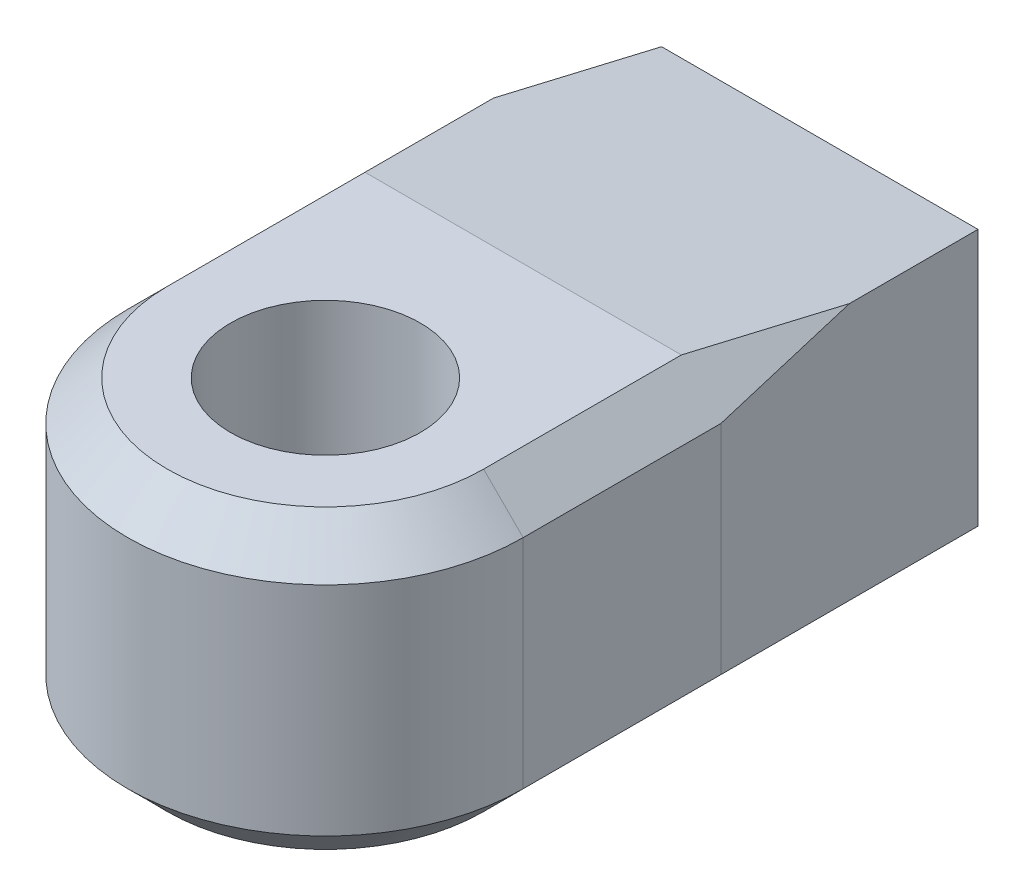
ISO-10303-21;
HEADER;
FILE_DESCRIPTION(('STEP AP214'),'2;1');
FILE_NAME('part.step','',(''),(''),'','','');
FILE_SCHEMA(('AUTOMOTIVE_DESIGN { 1 0 10303 214 1 1 1 1 }'));
ENDSEC;
DATA;
#1=APPLICATION_CONTEXT('core data for automotive mechanical design processes');
#2=APPLICATION_PROTOCOL_DEFINITION('international standard','automotive_design',2000,#1);
#3=PRODUCT_CONTEXT('',#1,'mechanical');
#4=PRODUCT('Part','Part','',(#3));
#5=PRODUCT_RELATED_PRODUCT_CATEGORY('part','',(#4));
#6=PRODUCT_DEFINITION_FORMATION('','',#4);
#7=PRODUCT_DEFINITION_CONTEXT('part definition',#1,'design');
#8=PRODUCT_DEFINITION('design','',#6,#7);
#9=PRODUCT_DEFINITION_SHAPE('','',#8);
#10=(LENGTH_UNIT() NAMED_UNIT(*) SI_UNIT(.MILLI.,.METRE.));
#11=(NAMED_UNIT(*) PLANE_ANGLE_UNIT() SI_UNIT($,.RADIAN.));
#12=(NAMED_UNIT(*) SI_UNIT($,.STERADIAN.) SOLID_ANGLE_UNIT());
#13=UNCERTAINTY_MEASURE_WITH_UNIT(LENGTH_MEASURE(1.E-05),#10,'distance_accuracy_value','');
#14=(GEOMETRIC_REPRESENTATION_CONTEXT(3) GLOBAL_UNCERTAINTY_ASSIGNED_CONTEXT((#13)) GLOBAL_UNIT_ASSIGNED_CONTEXT((#10,
#11,#12)) REPRESENTATION_CONTEXT('',''));
#15=CARTESIAN_POINT('',(0.,0.,0.));
#16=DIRECTION('',(0.,0.,1.));
#17=DIRECTION('',(1.,0.,0.));
#18=AXIS2_PLACEMENT_3D('',#15,#16,#17);
#19=CARTESIAN_POINT('',(0.,15.,0.));
#20=DIRECTION('',(0.,-1.,0.));
#21=DIRECTION('',(0.,0.,-1.));
#22=AXIS2_PLACEMENT_3D('',#19,#20,#21);
#23=CYLINDRICAL_SURFACE('',#22,10.);
#24=DIRECTION('',(0.,-1.,0.));
#25=VECTOR('',#24,1.);
#26=CARTESIAN_POINT('',(-10.,15.,0.));
#27=LINE('',#26,#25);
#28=CARTESIAN_POINT('',(-10.,13.,0.));
#29=VERTEX_POINT('',#28);
#30=CARTESIAN_POINT('',(-10.,1.99999999999999,0.));
#31=VERTEX_POINT('',#30);
#32=EDGE_CURVE('E218',#29,#31,#27,.T.);
#33=ORIENTED_EDGE('',*,*,#32,.T.);
#34=CARTESIAN_POINT('',(0.,1.99999999999999,0.));
#35=DIRECTION('',(0.,1.,0.));
#36=DIRECTION('',(0.,0.,1.));
#37=AXIS2_PLACEMENT_3D('',#34,#35,#36);
#38=CIRCLE('',#37,10.);
#39=CARTESIAN_POINT('',(10.,1.99999999999999,0.));
#40=VERTEX_POINT('',#39);
#41=EDGE_CURVE('E189',#31,#40,#38,.T.);
#42=ORIENTED_EDGE('',*,*,#41,.T.);
#43=DIRECTION('',(0.,-1.,0.));
#44=VECTOR('',#43,1.);
#45=CARTESIAN_POINT('',(10.,15.,0.));
#46=LINE('',#45,#44);
#47=CARTESIAN_POINT('',(10.,13.,0.));
#48=VERTEX_POINT('',#47);
#49=EDGE_CURVE('E159',#48,#40,#46,.T.);
#50=ORIENTED_EDGE('',*,*,#49,.F.);
#51=CARTESIAN_POINT('',(0.,13.,0.));
#52=DIRECTION('',(0.,1.,0.));
#53=DIRECTION('',(0.,0.,1.));
#54=AXIS2_PLACEMENT_3D('',#51,#52,#53);
#55=CIRCLE('',#54,10.);
#56=EDGE_CURVE('E187',#48,#29,#55,.F.);
#57=ORIENTED_EDGE('',*,*,#56,.T.);
#58=EDGE_LOOP('',(#33,#42,#50,#57));
#59=FACE_BOUND('',#58,.T.);
#60=ADVANCED_FACE('F38',(#59),#23,.T.);
#61=CARTESIAN_POINT('',(10.,15.,0.));
#62=DIRECTION('',(-1.,0.,0.));
#63=DIRECTION('',(0.,0.,1.));
#64=AXIS2_PLACEMENT_3D('',#61,#62,#63);
#65=PLANE('',#64);
#66=ORIENTED_EDGE('',*,*,#49,.T.);
#67=DIRECTION('',(0.,0.,-1.));
#68=VECTOR('',#67,1.);
#69=CARTESIAN_POINT('',(10.,1.99999999999999,0.));
#70=LINE('',#69,#68);
#71=CARTESIAN_POINT('',(10.,1.99999999999999,-9.9999999999996));
#72=VERTEX_POINT('',#71);
#73=EDGE_CURVE('E181',#40,#72,#70,.T.);
#74=ORIENTED_EDGE('',*,*,#73,.T.);
#75=DIRECTION('',(0.,1.,0.));
#76=VECTOR('',#75,1.);
#77=CARTESIAN_POINT('',(10.,15.,-9.9999999999996));
#78=LINE('',#77,#76);
#79=CARTESIAN_POINT('',(10.,13.,-9.9999999999996));
#80=VERTEX_POINT('',#79);
#81=EDGE_CURVE('E157',#72,#80,#78,.T.);
#82=ORIENTED_EDGE('',*,*,#81,.T.);
#83=DIRECTION('',(0.,0.,1.));
#84=VECTOR('',#83,1.);
#85=CARTESIAN_POINT('',(10.,13.,0.));
#86=LINE('',#85,#84);
#87=EDGE_CURVE('E179',#80,#48,#86,.T.);
#88=ORIENTED_EDGE('',*,*,#87,.T.);
#89=EDGE_LOOP('',(#66,#74,#82,#88));
#90=FACE_BOUND('',#89,.T.);
#91=ADVANCED_FACE('F239',(#90),#65,.F.);
#92=CARTESIAN_POINT('',(0.,15.,-25.));
#93=DIRECTION('',(0.,0.,-1.));
#94=DIRECTION('',(-1.,0.,0.));
#95=AXIS2_PLACEMENT_3D('',#92,#93,#94);
#96=PLANE('',#95);
#97=CARTESIAN_POINT('',(0.,7.2,-25.));
#98=DIRECTION('',(0.,0.,-1.));
#99=DIRECTION('',(-1.,0.,0.));
#100=AXIS2_PLACEMENT_3D('',#97,#98,#99);
#101=CIRCLE('',#100,3.);
#102=CARTESIAN_POINT('',(-3.,7.2,-25.));
#103=VERTEX_POINT('',#102);
#104=EDGE_CURVE('E200',#103,#103,#101,.T.);
#105=ORIENTED_EDGE('',*,*,#104,.F.);
#106=EDGE_LOOP('',(#105));
#107=FACE_BOUND('',#106,.T.);
#108=DIRECTION('',(1.,0.,0.));
#109=VECTOR('',#108,1.);
#110=CARTESIAN_POINT('',(0.,13.,-25.));
#111=LINE('',#110,#109);
#112=CARTESIAN_POINT('',(-8.,13.,-25.));
#113=VERTEX_POINT('',#112);
#114=CARTESIAN_POINT('',(8.,13.,-25.));
#115=VERTEX_POINT('',#114);
#116=EDGE_CURVE('E155',#113,#115,#111,.T.);
#117=ORIENTED_EDGE('',*,*,#116,.T.);
#118=DIRECTION('',(0.,-1.,0.));
#119=VECTOR('',#118,1.);
#120=CARTESIAN_POINT('',(8.,0.,-25.));
#121=LINE('',#120,#119);
#122=CARTESIAN_POINT('',(8.,0.,-25.));
#123=VERTEX_POINT('',#122);
#124=EDGE_CURVE('E148',#115,#123,#121,.T.);
#125=ORIENTED_EDGE('',*,*,#124,.T.);
#126=DIRECTION('',(1.,0.,0.));
#127=VECTOR('',#126,1.);
#128=CARTESIAN_POINT('',(0.,0.,-25.));
#129=LINE('',#128,#127);
#130=CARTESIAN_POINT('',(-8.,0.,-25.));
#131=VERTEX_POINT('',#130);
#132=EDGE_CURVE('E135',#131,#123,#129,.T.);
#133=ORIENTED_EDGE('',*,*,#132,.F.);
#134=DIRECTION('',(0.,1.,0.));
#135=VECTOR('',#134,1.);
#136=CARTESIAN_POINT('',(-8.,15.,-25.));
#137=LINE('',#136,#135);
#138=EDGE_CURVE('E145',#131,#113,#137,.T.);
#139=ORIENTED_EDGE('',*,*,#138,.T.);
#140=EDGE_LOOP('',(#117,#125,#133,#139));
#141=FACE_BOUND('',#140,.T.);
#142=ADVANCED_FACE('F144',(#107,#141),#96,.T.);
#143=CARTESIAN_POINT('',(-10.,15.,0.));
#144=DIRECTION('',(-1.,0.,0.));
#145=DIRECTION('',(0.,0.,1.));
#146=AXIS2_PLACEMENT_3D('',#143,#144,#145);
#147=PLANE('',#146);
#148=DIRECTION('',(0.,-1.,0.));
#149=VECTOR('',#148,1.);
#150=CARTESIAN_POINT('',(-10.,15.,-9.9999999999996));
#151=LINE('',#150,#149);
#152=CARTESIAN_POINT('',(-10.,13.,-9.9999999999996));
#153=VERTEX_POINT('',#152);
#154=CARTESIAN_POINT('',(-10.,1.99999999999999,-9.9999999999996));
#155=VERTEX_POINT('',#154);
#156=EDGE_CURVE('E165',#153,#155,#151,.T.);
#157=ORIENTED_EDGE('',*,*,#156,.T.);
#158=DIRECTION('',(0.,0.,1.));
#159=VECTOR('',#158,1.);
#160=CARTESIAN_POINT('',(-10.,1.99999999999999,0.));
#161=LINE('',#160,#159);
#162=EDGE_CURVE('E122',#155,#31,#161,.T.);
#163=ORIENTED_EDGE('',*,*,#162,.T.);
#164=ORIENTED_EDGE('',*,*,#32,.F.);
#165=DIRECTION('',(0.,0.,-1.));
#166=VECTOR('',#165,1.);
#167=CARTESIAN_POINT('',(-10.,13.,0.));
#168=LINE('',#167,#166);
#169=EDGE_CURVE('E127',#29,#153,#168,.T.);
#170=ORIENTED_EDGE('',*,*,#169,.T.);
#171=EDGE_LOOP('',(#157,#163,#164,#170));
#172=FACE_BOUND('',#171,.T.);
#173=ADVANCED_FACE('F216',(#172),#147,.T.);
#174=CARTESIAN_POINT('',(0.,15.,0.));
#175=DIRECTION('',(0.,-1.,0.));
#176=DIRECTION('',(0.,0.,-1.));
#177=AXIS2_PLACEMENT_3D('',#174,#175,#176);
#178=CYLINDRICAL_SURFACE('',#177,4.8);
#179=CARTESIAN_POINT('',(0.,15.,0.));
#180=DIRECTION('',(0.,1.,0.));
#181=DIRECTION('',(0.,0.,1.));
#182=AXIS2_PLACEMENT_3D('',#179,#180,#181);
#183=CIRCLE('',#182,4.8);
#184=CARTESIAN_POINT('',(0.,15.,4.8));
#185=VERTEX_POINT('',#184);
#186=EDGE_CURVE('E240',#185,#185,#183,.T.);
#187=ORIENTED_EDGE('',*,*,#186,.T.);
#188=EDGE_LOOP('',(#187));
#189=FACE_BOUND('',#188,.T.);
#190=CARTESIAN_POINT('',(0.,0.,0.));
#191=DIRECTION('',(0.,1.,0.));
#192=DIRECTION('',(0.,0.,1.));
#193=AXIS2_PLACEMENT_3D('',#190,#191,#192);
#194=CIRCLE('',#193,4.8);
#195=CARTESIAN_POINT('',(0.,0.,4.8));
#196=VERTEX_POINT('',#195);
#197=EDGE_CURVE('E149',#196,#196,#194,.T.);
#198=ORIENTED_EDGE('',*,*,#197,.F.);
#199=EDGE_LOOP('',(#198));
#200=FACE_BOUND('',#199,.T.);
#201=ADVANCED_FACE('F266',(#189,#200),#178,.F.);
#202=CARTESIAN_POINT('',(0.,15.,0.));
#203=DIRECTION('',(0.,1.,0.));
#204=DIRECTION('',(0.,0.,1.));
#205=AXIS2_PLACEMENT_3D('',#202,#203,#204);
#206=PLANE('',#205);
#207=CARTESIAN_POINT('',(0.,15.,0.));
#208=DIRECTION('',(0.,1.,0.));
#209=DIRECTION('',(0.,0.,1.));
#210=AXIS2_PLACEMENT_3D('',#207,#208,#209);
#211=CIRCLE('',#210,7.99999999999999);
#212=CARTESIAN_POINT('',(-7.99999999999999,15.,0.));
#213=VERTEX_POINT('',#212);
#214=CARTESIAN_POINT('',(7.99999999999999,15.,0.));
#215=VERTEX_POINT('',#214);
#216=EDGE_CURVE('E55',#213,#215,#211,.T.);
#217=ORIENTED_EDGE('',*,*,#216,.T.);
#218=DIRECTION('',(0.,0.,-1.));
#219=VECTOR('',#218,1.);
#220=CARTESIAN_POINT('',(7.99999999999999,15.,-9.9999999999996));
#221=LINE('',#220,#219);
#222=CARTESIAN_POINT('',(7.99999999999999,15.,-9.9999999999996));
#223=VERTEX_POINT('',#222);
#224=EDGE_CURVE('E193',#215,#223,#221,.T.);
#225=ORIENTED_EDGE('',*,*,#224,.T.);
#226=DIRECTION('',(-1.,0.,0.));
#227=VECTOR('',#226,1.);
#228=CARTESIAN_POINT('',(0.,15.,-9.9999999999996));
#229=LINE('',#228,#227);
#230=CARTESIAN_POINT('',(-7.99999999999999,15.,-9.9999999999996));
#231=VERTEX_POINT('',#230);
#232=EDGE_CURVE('E167',#223,#231,#229,.T.);
#233=ORIENTED_EDGE('',*,*,#232,.T.);
#234=DIRECTION('',(0.,0.,1.));
#235=VECTOR('',#234,1.);
#236=CARTESIAN_POINT('',(-7.99999999999999,15.,0.));
#237=LINE('',#236,#235);
#238=EDGE_CURVE('E60',#231,#213,#237,.T.);
#239=ORIENTED_EDGE('',*,*,#238,.T.);
#240=EDGE_LOOP('',(#217,#225,#233,#239));
#241=FACE_BOUND('',#240,.T.);
#242=ORIENTED_EDGE('',*,*,#186,.F.);
#243=EDGE_LOOP('',(#242));
#244=FACE_BOUND('',#243,.T.);
#245=ADVANCED_FACE('F335',(#241,#244),#206,.T.);
#246=CARTESIAN_POINT('',(0.,0.,0.));
#247=DIRECTION('',(0.,1.,0.));
#248=DIRECTION('',(0.,0.,1.));
#249=AXIS2_PLACEMENT_3D('',#246,#247,#248);
#250=PLANE('',#249);
#251=CARTESIAN_POINT('',(0.,0.,0.));
#252=DIRECTION('',(0.,1.,0.));
#253=DIRECTION('',(0.,0.,1.));
#254=AXIS2_PLACEMENT_3D('',#251,#252,#253);
#255=CIRCLE('',#254,8.);
#256=CARTESIAN_POINT('',(8.,0.,0.));
#257=VERTEX_POINT('',#256);
#258=CARTESIAN_POINT('',(-8.,0.,0.));
#259=VERTEX_POINT('',#258);
#260=EDGE_CURVE('E138',#257,#259,#255,.F.);
#261=ORIENTED_EDGE('',*,*,#260,.T.);
#262=DIRECTION('',(0.,0.,-1.));
#263=VECTOR('',#262,1.);
#264=CARTESIAN_POINT('',(-8.,0.,-9.9999999999996));
#265=LINE('',#264,#263);
#266=EDGE_CURVE('E121',#259,#131,#265,.T.);
#267=ORIENTED_EDGE('',*,*,#266,.T.);
#268=ORIENTED_EDGE('',*,*,#132,.T.);
#269=DIRECTION('',(0.,0.,1.));
#270=VECTOR('',#269,1.);
#271=CARTESIAN_POINT('',(8.,0.,0.));
#272=LINE('',#271,#270);
#273=EDGE_CURVE('E140',#123,#257,#272,.T.);
#274=ORIENTED_EDGE('',*,*,#273,.T.);
#275=EDGE_LOOP('',(#261,#267,#268,#274));
#276=FACE_BOUND('',#275,.T.);
#277=ORIENTED_EDGE('',*,*,#197,.T.);
#278=EDGE_LOOP('',(#277));
#279=FACE_BOUND('',#278,.T.);
#280=ADVANCED_FACE('F133',(#276,#279),#250,.F.);
#281=CARTESIAN_POINT('',(-10.,15.,-9.9999999999996));
#282=DIRECTION('',(0.991227900682635,0.,0.132163720091015));
#283=DIRECTION('',(0.,-1.,0.));
#284=AXIS2_PLACEMENT_3D('',#281,#282,#283);
#285=PLANE('',#284);
#286=ORIENTED_EDGE('',*,*,#138,.F.);
#287=DIRECTION('',(0.13102435641608,-0.13102435641608,-0.982682673120629));
#288=VECTOR('',#287,1.);
#289=CARTESIAN_POINT('',(-10.2231759656652,2.22317596566522,-8.32618025751038));
#290=LINE('',#289,#288);
#291=EDGE_CURVE('E117',#131,#155,#290,.F.);
#292=ORIENTED_EDGE('',*,*,#291,.T.);
#293=ORIENTED_EDGE('',*,*,#156,.F.);
#294=DIRECTION('',(0.13102435641608,0.13102435641608,-0.982682673120629));
#295=VECTOR('',#294,1.);
#296=CARTESIAN_POINT('',(-9.96566523605151,13.0343347639485,-10.2575107296133));
#297=LINE('',#296,#295);
#298=CARTESIAN_POINT('',(-9.,14.,-17.4999999999998));
#299=VERTEX_POINT('',#298);
#300=EDGE_CURVE('E128',#153,#299,#297,.T.);
#301=ORIENTED_EDGE('',*,*,#300,.T.);
#302=DIRECTION('',(-0.13102435641608,0.13102435641608,0.982682673120629));
#303=VECTOR('',#302,1.);
#304=CARTESIAN_POINT('',(-7.86266094420601,12.862660944206,-26.0300429184549));
#305=LINE('',#304,#303);
#306=EDGE_CURVE('E150',#113,#299,#305,.T.);
#307=ORIENTED_EDGE('',*,*,#306,.F.);
#308=EDGE_LOOP('',(#286,#292,#293,#301,#307));
#309=FACE_BOUND('',#308,.T.);
#310=ADVANCED_FACE('F152',(#309),#285,.F.);
#311=CARTESIAN_POINT('',(0.,13.,-25.));
#312=DIRECTION('',(0.,-0.991227900682635,0.132163720091015));
#313=DIRECTION('',(1.,0.,0.));
#314=AXIS2_PLACEMENT_3D('',#311,#312,#313);
#315=PLANE('',#314);
#316=ORIENTED_EDGE('',*,*,#232,.F.);
#317=DIRECTION('',(-0.131024356416081,0.13102435641608,0.982682673120628));
#318=VECTOR('',#317,1.);
#319=CARTESIAN_POINT('',(9.82832618025752,13.1716738197425,-23.7124463519314));
#320=LINE('',#319,#318);
#321=CARTESIAN_POINT('',(9.,14.,-17.4999999999998));
#322=VERTEX_POINT('',#321);
#323=EDGE_CURVE('E11',#223,#322,#320,.F.);
#324=ORIENTED_EDGE('',*,*,#323,.T.);
#325=DIRECTION('',(0.13102435641608,0.13102435641608,0.982682673120629));
#326=VECTOR('',#325,1.);
#327=CARTESIAN_POINT('',(7.86266094420601,12.862660944206,-26.0300429184549));
#328=LINE('',#327,#326);
#329=EDGE_CURVE('E169',#115,#322,#328,.T.);
#330=ORIENTED_EDGE('',*,*,#329,.F.);
#331=ORIENTED_EDGE('',*,*,#116,.F.);
#332=ORIENTED_EDGE('',*,*,#306,.T.);
#333=DIRECTION('',(0.131024356416081,0.13102435641608,0.982682673120628));
#334=VECTOR('',#333,1.);
#335=CARTESIAN_POINT('',(-9.82832618025752,13.1716738197425,-23.7124463519314));
#336=LINE('',#335,#334);
#337=EDGE_CURVE('E47',#299,#231,#336,.T.);
#338=ORIENTED_EDGE('',*,*,#337,.T.);
#339=EDGE_LOOP('',(#316,#324,#330,#331,#332,#338));
#340=FACE_BOUND('',#339,.T.);
#341=ADVANCED_FACE('F221',(#340),#315,.F.);
#342=CARTESIAN_POINT('',(8.,15.,-25.));
#343=DIRECTION('',(0.991227900682635,0.,-0.132163720091015));
#344=DIRECTION('',(0.,1.,0.));
#345=AXIS2_PLACEMENT_3D('',#342,#343,#344);
#346=PLANE('',#345);
#347=ORIENTED_EDGE('',*,*,#81,.F.);
#348=DIRECTION('',(0.13102435641608,0.13102435641608,0.982682673120629));
#349=VECTOR('',#348,1.);
#350=CARTESIAN_POINT('',(8.25751072961372,0.257510729613719,-23.0686695278971));
#351=LINE('',#350,#349);
#352=EDGE_CURVE('E185',#72,#123,#351,.F.);
#353=ORIENTED_EDGE('',*,*,#352,.T.);
#354=ORIENTED_EDGE('',*,*,#124,.F.);
#355=ORIENTED_EDGE('',*,*,#329,.T.);
#356=DIRECTION('',(0.13102435641608,-0.13102435641608,0.982682673120629));
#357=VECTOR('',#356,1.);
#358=CARTESIAN_POINT('',(8.,15.,-25.));
#359=LINE('',#358,#357);
#360=EDGE_CURVE('E183',#322,#80,#359,.T.);
#361=ORIENTED_EDGE('',*,*,#360,.T.);
#362=EDGE_LOOP('',(#347,#353,#354,#355,#361));
#363=FACE_BOUND('',#362,.T.);
#364=ADVANCED_FACE('F226',(#363),#346,.T.);
#365=CARTESIAN_POINT('',(0.,7.2,-10.));
#366=DIRECTION('',(0.,0.,-1.));
#367=DIRECTION('',(-1.,0.,0.));
#368=AXIS2_PLACEMENT_3D('',#365,#366,#367);
#369=CYLINDRICAL_SURFACE('',#368,3.);
#370=CARTESIAN_POINT('',(0.,7.2,-10.));
#371=DIRECTION('',(0.,0.,-1.));
#372=DIRECTION('',(-1.,0.,0.));
#373=AXIS2_PLACEMENT_3D('',#370,#371,#372);
#374=CIRCLE('',#373,3.);
#375=CARTESIAN_POINT('',(-3.,7.2,-10.));
#376=VERTEX_POINT('',#375);
#377=EDGE_CURVE('E172',#376,#376,#374,.T.);
#378=ORIENTED_EDGE('',*,*,#377,.F.);
#379=EDGE_LOOP('',(#378));
#380=FACE_BOUND('',#379,.T.);
#381=ORIENTED_EDGE('',*,*,#104,.T.);
#382=EDGE_LOOP('',(#381));
#383=FACE_BOUND('',#382,.T.);
#384=ADVANCED_FACE('F254',(#380,#383),#369,.F.);
#385=CARTESIAN_POINT('',(0.,7.2,-10.));
#386=DIRECTION('',(0.,0.,-1.));
#387=DIRECTION('',(-1.,0.,0.));
#388=AXIS2_PLACEMENT_3D('',#385,#386,#387);
#389=PLANE('',#388);
#390=ORIENTED_EDGE('',*,*,#377,.T.);
#391=EDGE_LOOP('',(#390));
#392=FACE_BOUND('',#391,.T.);
#393=ADVANCED_FACE('F252',(#392),#389,.T.);
#394=CARTESIAN_POINT('',(10.,1.99999999999999,0.));
#395=DIRECTION('',(-0.707106781186546,0.707106781186549,0.));
#396=DIRECTION('',(0.,0.,-1.));
#397=AXIS2_PLACEMENT_3D('',#394,#395,#396);
#398=PLANE('',#397);
#399=ORIENTED_EDGE('',*,*,#352,.F.);
#400=ORIENTED_EDGE('',*,*,#73,.F.);
#401=DIRECTION('',(0.707106781186549,0.707106781186546,0.));
#402=VECTOR('',#401,1.);
#403=CARTESIAN_POINT('',(8.,0.,0.));
#404=LINE('',#403,#402);
#405=EDGE_CURVE('E198',#257,#40,#404,.T.);
#406=ORIENTED_EDGE('',*,*,#405,.F.);
#407=ORIENTED_EDGE('',*,*,#273,.F.);
#408=EDGE_LOOP('',(#399,#400,#406,#407));
#409=FACE_BOUND('',#408,.T.);
#410=ADVANCED_FACE('F230',(#409),#398,.F.);
#411=CARTESIAN_POINT('',(0.,1.99999999999999,0.));
#412=DIRECTION('',(0.,1.,0.));
#413=DIRECTION('',(0.,0.,1.));
#414=AXIS2_PLACEMENT_3D('',#411,#412,#413);
#415=CONICAL_SURFACE('',#414,10.,0.785398163397451);
#416=ORIENTED_EDGE('',*,*,#405,.T.);
#417=ORIENTED_EDGE('',*,*,#41,.F.);
#418=DIRECTION('',(-0.707106781186549,0.707106781186546,0.));
#419=VECTOR('',#418,1.);
#420=CARTESIAN_POINT('',(-8.,0.,0.));
#421=LINE('',#420,#419);
#422=EDGE_CURVE('E196',#259,#31,#421,.T.);
#423=ORIENTED_EDGE('',*,*,#422,.F.);
#424=ORIENTED_EDGE('',*,*,#260,.F.);
#425=EDGE_LOOP('',(#416,#417,#423,#424));
#426=FACE_BOUND('',#425,.T.);
#427=ADVANCED_FACE('F234',(#426),#415,.T.);
#428=CARTESIAN_POINT('',(-8.,0.,0.));
#429=DIRECTION('',(-0.707106781186546,-0.707106781186549,0.));
#430=DIRECTION('',(0.,0.,1.));
#431=AXIS2_PLACEMENT_3D('',#428,#429,#430);
#432=PLANE('',#431);
#433=ORIENTED_EDGE('',*,*,#422,.T.);
#434=ORIENTED_EDGE('',*,*,#162,.F.);
#435=ORIENTED_EDGE('',*,*,#291,.F.);
#436=ORIENTED_EDGE('',*,*,#266,.F.);
#437=EDGE_LOOP('',(#433,#434,#435,#436));
#438=FACE_BOUND('',#437,.T.);
#439=ADVANCED_FACE('F120',(#438),#432,.T.);
#440=CARTESIAN_POINT('',(-10.,13.,0.));
#441=DIRECTION('',(0.707106781186546,-0.707106781186549,0.));
#442=DIRECTION('',(0.,0.,-1.));
#443=AXIS2_PLACEMENT_3D('',#440,#441,#442);
#444=PLANE('',#443);
#445=ORIENTED_EDGE('',*,*,#300,.F.);
#446=ORIENTED_EDGE('',*,*,#169,.F.);
#447=DIRECTION('',(-0.707106781186549,-0.707106781186546,0.));
#448=VECTOR('',#447,1.);
#449=CARTESIAN_POINT('',(-7.99999999999999,15.,0.));
#450=LINE('',#449,#448);
#451=EDGE_CURVE('E42',#213,#29,#450,.T.);
#452=ORIENTED_EDGE('',*,*,#451,.F.);
#453=ORIENTED_EDGE('',*,*,#238,.F.);
#454=ORIENTED_EDGE('',*,*,#337,.F.);
#455=EDGE_LOOP('',(#445,#446,#452,#453,#454));
#456=FACE_BOUND('',#455,.T.);
#457=ADVANCED_FACE('F40',(#456),#444,.F.);
#458=CARTESIAN_POINT('',(0.,15.,0.));
#459=DIRECTION('',(0.,-1.,0.));
#460=DIRECTION('',(0.,0.,-1.));
#461=AXIS2_PLACEMENT_3D('',#458,#459,#460);
#462=CONICAL_SURFACE('',#461,7.99999999999999,0.78539816339745);
#463=ORIENTED_EDGE('',*,*,#451,.T.);
#464=ORIENTED_EDGE('',*,*,#56,.F.);
#465=DIRECTION('',(0.707106781186549,-0.707106781186546,0.));
#466=VECTOR('',#465,1.);
#467=CARTESIAN_POINT('',(7.99999999999999,15.,0.));
#468=LINE('',#467,#466);
#469=EDGE_CURVE('E201',#215,#48,#468,.T.);
#470=ORIENTED_EDGE('',*,*,#469,.F.);
#471=ORIENTED_EDGE('',*,*,#216,.F.);
#472=EDGE_LOOP('',(#463,#464,#470,#471));
#473=FACE_BOUND('',#472,.T.);
#474=ADVANCED_FACE('F209',(#473),#462,.T.);
#475=CARTESIAN_POINT('',(7.99999999999999,15.,0.));
#476=DIRECTION('',(0.707106781186546,0.707106781186549,0.));
#477=DIRECTION('',(0.,0.,1.));
#478=AXIS2_PLACEMENT_3D('',#475,#476,#477);
#479=PLANE('',#478);
#480=ORIENTED_EDGE('',*,*,#469,.T.);
#481=ORIENTED_EDGE('',*,*,#87,.F.);
#482=ORIENTED_EDGE('',*,*,#360,.F.);
#483=ORIENTED_EDGE('',*,*,#323,.F.);
#484=ORIENTED_EDGE('',*,*,#224,.F.);
#485=EDGE_LOOP('',(#480,#481,#482,#483,#484));
#486=FACE_BOUND('',#485,.T.);
#487=ADVANCED_FACE('F286',(#486),#479,.T.);
#488=CLOSED_SHELL('',(#60,#91,#142,#173,#201,#245,#280,#310,#341,#364,#384,#393,#410,#427,#439,
#457,#474,#487));
#489=MANIFOLD_SOLID_BREP('B2',#488);
#490=ADVANCED_BREP_SHAPE_REPRESENTATION('',(#18,#489),#14);
#491=SHAPE_DEFINITION_REPRESENTATION(#9,#490);
ENDSEC;
END-ISO-10303-21;
